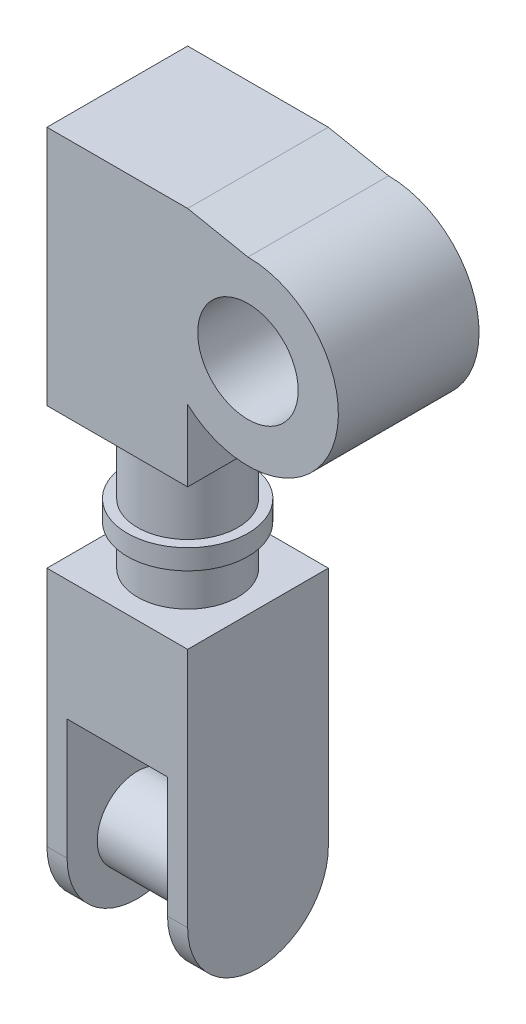
ISO-10303-21;
HEADER;
FILE_DESCRIPTION(('STEP AP214'),'2;1');
FILE_NAME('part.step','',(''),(''),'','','');
FILE_SCHEMA(('AUTOMOTIVE_DESIGN { 1 0 10303 214 1 1 1 1 }'));
ENDSEC;
DATA;
#1=APPLICATION_CONTEXT('core data for automotive mechanical design processes');
#2=APPLICATION_PROTOCOL_DEFINITION('international standard','automotive_design',2000,#1);
#3=PRODUCT_CONTEXT('',#1,'mechanical');
#4=PRODUCT('Part','Part','',(#3));
#5=PRODUCT_RELATED_PRODUCT_CATEGORY('part','',(#4));
#6=PRODUCT_DEFINITION_FORMATION('','',#4);
#7=PRODUCT_DEFINITION_CONTEXT('part definition',#1,'design');
#8=PRODUCT_DEFINITION('design','',#6,#7);
#9=PRODUCT_DEFINITION_SHAPE('','',#8);
#10=(LENGTH_UNIT() NAMED_UNIT(*) SI_UNIT(.MILLI.,.METRE.));
#11=(NAMED_UNIT(*) PLANE_ANGLE_UNIT() SI_UNIT($,.RADIAN.));
#12=(NAMED_UNIT(*) SI_UNIT($,.STERADIAN.) SOLID_ANGLE_UNIT());
#13=UNCERTAINTY_MEASURE_WITH_UNIT(LENGTH_MEASURE(1.E-05),#10,'distance_accuracy_value','');
#14=(GEOMETRIC_REPRESENTATION_CONTEXT(3) GLOBAL_UNCERTAINTY_ASSIGNED_CONTEXT((#13)) GLOBAL_UNIT_ASSIGNED_CONTEXT((#10,
#11,#12)) REPRESENTATION_CONTEXT('',''));
#15=CARTESIAN_POINT('',(0.,0.,0.));
#16=DIRECTION('',(0.,0.,1.));
#17=DIRECTION('',(1.,0.,0.));
#18=AXIS2_PLACEMENT_3D('',#15,#16,#17);
#19=CARTESIAN_POINT('',(35.,0.,35.));
#20=DIRECTION('',(0.,0.,-1.));
#21=DIRECTION('',(0.,1.,0.));
#22=AXIS2_PLACEMENT_3D('',#19,#20,#21);
#23=PLANE('',#22);
#24=DIRECTION('',(0.,-1.,0.));
#25=VECTOR('',#24,1.);
#26=CARTESIAN_POINT('',(-25.,0.,35.));
#27=LINE('',#26,#25);
#28=CARTESIAN_POINT('',(-25.,-130.,35.));
#29=VERTEX_POINT('',#28);
#30=CARTESIAN_POINT('',(-25.,-190.,35.));
#31=VERTEX_POINT('',#30);
#32=EDGE_CURVE('E155',#29,#31,#27,.T.);
#33=ORIENTED_EDGE('',*,*,#32,.F.);
#34=DIRECTION('',(1.,0.,0.));
#35=VECTOR('',#34,1.);
#36=CARTESIAN_POINT('',(-25.,-130.,35.));
#37=LINE('',#36,#35);
#38=CARTESIAN_POINT('',(25.,-130.,35.));
#39=VERTEX_POINT('',#38);
#40=EDGE_CURVE('E565',#29,#39,#37,.T.);
#41=ORIENTED_EDGE('',*,*,#40,.T.);
#42=DIRECTION('',(0.,-1.,0.));
#43=VECTOR('',#42,1.);
#44=CARTESIAN_POINT('',(25.,0.,35.));
#45=LINE('',#44,#43);
#46=CARTESIAN_POINT('',(25.,-190.,35.));
#47=VERTEX_POINT('',#46);
#48=EDGE_CURVE('E546',#39,#47,#45,.T.);
#49=ORIENTED_EDGE('',*,*,#48,.T.);
#50=DIRECTION('',(-1.,0.,0.));
#51=VECTOR('',#50,1.);
#52=CARTESIAN_POINT('',(35.,-190.,35.));
#53=LINE('',#52,#51);
#54=CARTESIAN_POINT('',(35.,-190.,35.));
#55=VERTEX_POINT('',#54);
#56=EDGE_CURVE('E182',#55,#47,#53,.T.);
#57=ORIENTED_EDGE('',*,*,#56,.F.);
#58=DIRECTION('',(0.,-1.,0.));
#59=VECTOR('',#58,1.);
#60=CARTESIAN_POINT('',(35.,0.,35.));
#61=LINE('',#60,#59);
#62=CARTESIAN_POINT('',(35.,-70.,35.));
#63=VERTEX_POINT('',#62);
#64=EDGE_CURVE('E570',#63,#55,#61,.T.);
#65=ORIENTED_EDGE('',*,*,#64,.F.);
#66=DIRECTION('',(-1.,0.,0.));
#67=VECTOR('',#66,1.);
#68=CARTESIAN_POINT('',(35.,-70.,35.));
#69=LINE('',#68,#67);
#70=CARTESIAN_POINT('',(-35.,-70.,35.));
#71=VERTEX_POINT('',#70);
#72=EDGE_CURVE('E585',#63,#71,#69,.T.);
#73=ORIENTED_EDGE('',*,*,#72,.T.);
#74=DIRECTION('',(0.,-1.,0.));
#75=VECTOR('',#74,1.);
#76=CARTESIAN_POINT('',(-35.,0.,35.));
#77=LINE('',#76,#75);
#78=CARTESIAN_POINT('',(-35.,-190.,35.));
#79=VERTEX_POINT('',#78);
#80=EDGE_CURVE('E180',#71,#79,#77,.T.);
#81=ORIENTED_EDGE('',*,*,#80,.T.);
#82=EDGE_CURVE('E172',#31,#79,#53,.T.);
#83=ORIENTED_EDGE('',*,*,#82,.F.);
#84=EDGE_LOOP('',(#33,#41,#49,#57,#65,#73,#81,#83));
#85=FACE_BOUND('',#84,.T.);
#86=ADVANCED_FACE('F41',(#85),#23,.F.);
#87=CARTESIAN_POINT('',(35.,-190.,0.));
#88=DIRECTION('',(-1.,0.,0.));
#89=DIRECTION('',(0.,0.,1.));
#90=AXIS2_PLACEMENT_3D('',#87,#88,#89);
#91=CYLINDRICAL_SURFACE('',#90,35.);
#92=CARTESIAN_POINT('',(-25.,-190.,0.));
#93=DIRECTION('',(1.,0.,0.));
#94=DIRECTION('',(0.,0.,-1.));
#95=AXIS2_PLACEMENT_3D('',#92,#93,#94);
#96=CIRCLE('',#95,35.);
#97=CARTESIAN_POINT('',(-25.,-190.,-35.));
#98=VERTEX_POINT('',#97);
#99=EDGE_CURVE('E159',#31,#98,#96,.T.);
#100=ORIENTED_EDGE('',*,*,#99,.F.);
#101=ORIENTED_EDGE('',*,*,#82,.T.);
#102=CARTESIAN_POINT('',(-35.,-190.,0.));
#103=DIRECTION('',(1.,0.,0.));
#104=DIRECTION('',(0.,0.,-1.));
#105=AXIS2_PLACEMENT_3D('',#102,#103,#104);
#106=CIRCLE('',#105,35.);
#107=CARTESIAN_POINT('',(-35.,-190.,-35.));
#108=VERTEX_POINT('',#107);
#109=EDGE_CURVE('E588',#79,#108,#106,.T.);
#110=ORIENTED_EDGE('',*,*,#109,.T.);
#111=DIRECTION('',(-1.,0.,0.));
#112=VECTOR('',#111,1.);
#113=CARTESIAN_POINT('',(35.,-190.,-35.));
#114=LINE('',#113,#112);
#115=EDGE_CURVE('E174',#98,#108,#114,.T.);
#116=ORIENTED_EDGE('',*,*,#115,.F.);
#117=EDGE_LOOP('',(#100,#101,#110,#116));
#118=FACE_BOUND('',#117,.T.);
#119=ADVANCED_FACE('F170',(#118),#91,.T.);
#120=CARTESIAN_POINT('',(35.,0.,-35.));
#121=DIRECTION('',(0.,0.,1.));
#122=DIRECTION('',(1.,0.,0.));
#123=AXIS2_PLACEMENT_3D('',#120,#121,#122);
#124=PLANE('',#123);
#125=DIRECTION('',(0.,-1.,0.));
#126=VECTOR('',#125,1.);
#127=CARTESIAN_POINT('',(-25.,0.,-35.));
#128=LINE('',#127,#126);
#129=CARTESIAN_POINT('',(-25.,-130.,-35.));
#130=VERTEX_POINT('',#129);
#131=EDGE_CURVE('E176',#130,#98,#128,.T.);
#132=ORIENTED_EDGE('',*,*,#131,.T.);
#133=ORIENTED_EDGE('',*,*,#115,.T.);
#134=DIRECTION('',(0.,1.,0.));
#135=VECTOR('',#134,1.);
#136=CARTESIAN_POINT('',(-35.,0.,-35.));
#137=LINE('',#136,#135);
#138=CARTESIAN_POINT('',(-35.,-70.,-35.));
#139=VERTEX_POINT('',#138);
#140=EDGE_CURVE('E591',#108,#139,#137,.T.);
#141=ORIENTED_EDGE('',*,*,#140,.T.);
#142=DIRECTION('',(-1.,0.,0.));
#143=VECTOR('',#142,1.);
#144=CARTESIAN_POINT('',(35.,-70.,-35.));
#145=LINE('',#144,#143);
#146=CARTESIAN_POINT('',(35.,-70.,-35.));
#147=VERTEX_POINT('',#146);
#148=EDGE_CURVE('E599',#147,#139,#145,.T.);
#149=ORIENTED_EDGE('',*,*,#148,.F.);
#150=DIRECTION('',(0.,1.,0.));
#151=VECTOR('',#150,1.);
#152=CARTESIAN_POINT('',(35.,0.,-35.));
#153=LINE('',#152,#151);
#154=CARTESIAN_POINT('',(35.,-190.,-35.));
#155=VERTEX_POINT('',#154);
#156=EDGE_CURVE('E578',#155,#147,#153,.T.);
#157=ORIENTED_EDGE('',*,*,#156,.F.);
#158=CARTESIAN_POINT('',(25.,-190.,-35.));
#159=VERTEX_POINT('',#158);
#160=EDGE_CURVE('E183',#155,#159,#114,.T.);
#161=ORIENTED_EDGE('',*,*,#160,.T.);
#162=DIRECTION('',(0.,-1.,0.));
#163=VECTOR('',#162,1.);
#164=CARTESIAN_POINT('',(25.,0.,-35.));
#165=LINE('',#164,#163);
#166=CARTESIAN_POINT('',(25.,-130.,-35.));
#167=VERTEX_POINT('',#166);
#168=EDGE_CURVE('E560',#167,#159,#165,.T.);
#169=ORIENTED_EDGE('',*,*,#168,.F.);
#170=DIRECTION('',(1.,0.,0.));
#171=VECTOR('',#170,1.);
#172=CARTESIAN_POINT('',(-25.,-130.,-35.));
#173=LINE('',#172,#171);
#174=EDGE_CURVE('E57',#130,#167,#173,.T.);
#175=ORIENTED_EDGE('',*,*,#174,.F.);
#176=EDGE_LOOP('',(#132,#133,#141,#149,#157,#161,#169,#175));
#177=FACE_BOUND('',#176,.T.);
#178=ADVANCED_FACE('F291',(#177),#124,.F.);
#179=CARTESIAN_POINT('',(35.,120.,35.));
#180=DIRECTION('',(-1.,0.,0.));
#181=DIRECTION('',(0.,0.,1.));
#182=AXIS2_PLACEMENT_3D('',#179,#180,#181);
#183=PLANE('',#182);
#184=DIRECTION('',(0.,-1.,0.));
#185=VECTOR('',#184,1.);
#186=CARTESIAN_POINT('',(35.,120.,-35.));
#187=LINE('',#186,#185);
#188=CARTESIAN_POINT('',(35.,35.5071731198865,-35.));
#189=VERTEX_POINT('',#188);
#190=CARTESIAN_POINT('',(35.,0.,-35.));
#191=VERTEX_POINT('',#190);
#192=EDGE_CURVE('E244',#189,#191,#187,.T.);
#193=ORIENTED_EDGE('',*,*,#192,.F.);
#194=DIRECTION('',(0.,0.,1.));
#195=VECTOR('',#194,1.);
#196=CARTESIAN_POINT('',(35.,35.5071731198865,-35.));
#197=LINE('',#196,#195);
#198=CARTESIAN_POINT('',(35.,35.5071731198865,35.));
#199=VERTEX_POINT('',#198);
#200=EDGE_CURVE('E212',#189,#199,#197,.T.);
#201=ORIENTED_EDGE('',*,*,#200,.T.);
#202=DIRECTION('',(0.,-1.,0.));
#203=VECTOR('',#202,1.);
#204=CARTESIAN_POINT('',(35.,120.,35.));
#205=LINE('',#204,#203);
#206=CARTESIAN_POINT('',(35.,0.,35.));
#207=VERTEX_POINT('',#206);
#208=EDGE_CURVE('E87',#199,#207,#205,.T.);
#209=ORIENTED_EDGE('',*,*,#208,.T.);
#210=DIRECTION('',(0.,0.,-1.));
#211=VECTOR('',#210,1.);
#212=CARTESIAN_POINT('',(35.,0.,35.));
#213=LINE('',#212,#211);
#214=EDGE_CURVE('E240',#207,#191,#213,.T.);
#215=ORIENTED_EDGE('',*,*,#214,.T.);
#216=EDGE_LOOP('',(#193,#201,#209,#215));
#217=FACE_BOUND('',#216,.T.);
#218=ADVANCED_FACE('F43',(#217),#183,.F.);
#219=CARTESIAN_POINT('',(-35.,120.,-35.));
#220=DIRECTION('',(0.,0.,1.));
#221=DIRECTION('',(1.,0.,0.));
#222=AXIS2_PLACEMENT_3D('',#219,#220,#221);
#223=PLANE('',#222);
#224=DIRECTION('',(-1.,0.,0.));
#225=VECTOR('',#224,1.);
#226=CARTESIAN_POINT('',(-35.,0.,-35.));
#227=LINE('',#226,#225);
#228=CARTESIAN_POINT('',(-35.,0.,-35.));
#229=VERTEX_POINT('',#228);
#230=EDGE_CURVE('E260',#191,#229,#227,.T.);
#231=ORIENTED_EDGE('',*,*,#230,.T.);
#232=DIRECTION('',(0.,-1.,0.));
#233=VECTOR('',#232,1.);
#234=CARTESIAN_POINT('',(-35.,120.,-35.));
#235=LINE('',#234,#233);
#236=CARTESIAN_POINT('',(-35.,120.,-35.));
#237=VERTEX_POINT('',#236);
#238=EDGE_CURVE('E274',#237,#229,#235,.T.);
#239=ORIENTED_EDGE('',*,*,#238,.F.);
#240=DIRECTION('',(-1.,0.,0.));
#241=VECTOR('',#240,1.);
#242=CARTESIAN_POINT('',(-35.,120.,-35.));
#243=LINE('',#242,#241);
#244=CARTESIAN_POINT('',(35.,120.,-35.));
#245=VERTEX_POINT('',#244);
#246=EDGE_CURVE('E249',#245,#237,#243,.T.);
#247=ORIENTED_EDGE('',*,*,#246,.F.);
#248=DIRECTION('',(0.980882527347109,-0.194600790196619,0.));
#249=VECTOR('',#248,1.);
#250=CARTESIAN_POINT('',(24.2310931534967,122.136481916495,-35.));
#251=LINE('',#250,#249);
#252=CARTESIAN_POINT('',(65.,114.048192782383,-35.));
#253=VERTEX_POINT('',#252);
#254=EDGE_CURVE('E94',#245,#253,#251,.T.);
#255=ORIENTED_EDGE('',*,*,#254,.T.);
#256=CARTESIAN_POINT('',(65.,69.0481927823834,-35.));
#257=DIRECTION('',(0.,0.,1.));
#258=DIRECTION('',(1.,0.,0.));
#259=AXIS2_PLACEMENT_3D('',#256,#257,#258);
#260=CIRCLE('',#259,45.);
#261=EDGE_CURVE('E205',#189,#253,#260,.T.);
#262=ORIENTED_EDGE('',*,*,#261,.F.);
#263=ORIENTED_EDGE('',*,*,#192,.T.);
#264=EDGE_LOOP('',(#231,#239,#247,#255,#262,#263));
#265=FACE_BOUND('',#264,.T.);
#266=CARTESIAN_POINT('',(65.,69.0481927823834,-35.));
#267=DIRECTION('',(0.,0.,1.));
#268=DIRECTION('',(1.,0.,0.));
#269=AXIS2_PLACEMENT_3D('',#266,#267,#268);
#270=CIRCLE('',#269,25.);
#271=CARTESIAN_POINT('',(90.,69.0481927823834,-35.));
#272=VERTEX_POINT('',#271);
#273=EDGE_CURVE('E201',#272,#272,#270,.T.);
#274=ORIENTED_EDGE('',*,*,#273,.T.);
#275=EDGE_LOOP('',(#274));
#276=FACE_BOUND('',#275,.T.);
#277=ADVANCED_FACE('F282',(#265,#276),#223,.F.);
#278=CARTESIAN_POINT('',(-35.,120.,35.));
#279=DIRECTION('',(1.,0.,0.));
#280=DIRECTION('',(0.,0.,-1.));
#281=AXIS2_PLACEMENT_3D('',#278,#279,#280);
#282=PLANE('',#281);
#283=DIRECTION('',(0.,0.,1.));
#284=VECTOR('',#283,1.);
#285=CARTESIAN_POINT('',(-35.,0.,35.));
#286=LINE('',#285,#284);
#287=CARTESIAN_POINT('',(-35.,0.,35.));
#288=VERTEX_POINT('',#287);
#289=EDGE_CURVE('E263',#229,#288,#286,.T.);
#290=ORIENTED_EDGE('',*,*,#289,.T.);
#291=DIRECTION('',(0.,-1.,0.));
#292=VECTOR('',#291,1.);
#293=CARTESIAN_POINT('',(-35.,120.,35.));
#294=LINE('',#293,#292);
#295=CARTESIAN_POINT('',(-35.,120.,35.));
#296=VERTEX_POINT('',#295);
#297=EDGE_CURVE('E270',#296,#288,#294,.T.);
#298=ORIENTED_EDGE('',*,*,#297,.F.);
#299=DIRECTION('',(0.,0.,1.));
#300=VECTOR('',#299,1.);
#301=CARTESIAN_POINT('',(-35.,120.,35.));
#302=LINE('',#301,#300);
#303=EDGE_CURVE('E66',#237,#296,#302,.T.);
#304=ORIENTED_EDGE('',*,*,#303,.F.);
#305=ORIENTED_EDGE('',*,*,#238,.T.);
#306=EDGE_LOOP('',(#290,#298,#304,#305));
#307=FACE_BOUND('',#306,.T.);
#308=ADVANCED_FACE('F296',(#307),#282,.F.);
#309=CARTESIAN_POINT('',(-35.,120.,35.));
#310=DIRECTION('',(0.,0.,-1.));
#311=DIRECTION('',(-1.,0.,0.));
#312=AXIS2_PLACEMENT_3D('',#309,#310,#311);
#313=PLANE('',#312);
#314=DIRECTION('',(1.,0.,0.));
#315=VECTOR('',#314,1.);
#316=CARTESIAN_POINT('',(-35.,0.,35.));
#317=LINE('',#316,#315);
#318=EDGE_CURVE('E250',#288,#207,#317,.T.);
#319=ORIENTED_EDGE('',*,*,#318,.T.);
#320=ORIENTED_EDGE('',*,*,#208,.F.);
#321=CARTESIAN_POINT('',(65.,69.0481927823834,35.));
#322=DIRECTION('',(0.,0.,1.));
#323=DIRECTION('',(1.,0.,0.));
#324=AXIS2_PLACEMENT_3D('',#321,#322,#323);
#325=CIRCLE('',#324,45.);
#326=CARTESIAN_POINT('',(65.,114.048192782383,35.));
#327=VERTEX_POINT('',#326);
#328=EDGE_CURVE('E216',#199,#327,#325,.T.);
#329=ORIENTED_EDGE('',*,*,#328,.T.);
#330=DIRECTION('',(0.980882527347109,-0.194600790196619,0.));
#331=VECTOR('',#330,1.);
#332=CARTESIAN_POINT('',(24.2310931534967,122.136481916495,35.));
#333=LINE('',#332,#331);
#334=CARTESIAN_POINT('',(35.,120.,35.));
#335=VERTEX_POINT('',#334);
#336=EDGE_CURVE('E206',#335,#327,#333,.T.);
#337=ORIENTED_EDGE('',*,*,#336,.F.);
#338=DIRECTION('',(1.,0.,0.));
#339=VECTOR('',#338,1.);
#340=CARTESIAN_POINT('',(-35.,120.,35.));
#341=LINE('',#340,#339);
#342=EDGE_CURVE('E255',#296,#335,#341,.T.);
#343=ORIENTED_EDGE('',*,*,#342,.F.);
#344=ORIENTED_EDGE('',*,*,#297,.T.);
#345=EDGE_LOOP('',(#319,#320,#329,#337,#343,#344));
#346=FACE_BOUND('',#345,.T.);
#347=CARTESIAN_POINT('',(65.,69.0481927823834,35.));
#348=DIRECTION('',(0.,0.,1.));
#349=DIRECTION('',(1.,0.,0.));
#350=AXIS2_PLACEMENT_3D('',#347,#348,#349);
#351=CIRCLE('',#350,25.);
#352=CARTESIAN_POINT('',(90.,69.0481927823834,35.));
#353=VERTEX_POINT('',#352);
#354=EDGE_CURVE('E196',#353,#353,#351,.T.);
#355=ORIENTED_EDGE('',*,*,#354,.F.);
#356=EDGE_LOOP('',(#355));
#357=FACE_BOUND('',#356,.T.);
#358=ADVANCED_FACE('F341',(#346,#357),#313,.F.);
#359=CARTESIAN_POINT('',(0.,120.,0.));
#360=DIRECTION('',(0.,-1.,0.));
#361=DIRECTION('',(0.,0.,-1.));
#362=AXIS2_PLACEMENT_3D('',#359,#360,#361);
#363=PLANE('',#362);
#364=DIRECTION('',(0.,0.,-1.));
#365=VECTOR('',#364,1.);
#366=CARTESIAN_POINT('',(35.,120.,35.));
#367=LINE('',#366,#365);
#368=EDGE_CURVE('E245',#335,#245,#367,.T.);
#369=ORIENTED_EDGE('',*,*,#368,.T.);
#370=ORIENTED_EDGE('',*,*,#246,.T.);
#371=ORIENTED_EDGE('',*,*,#303,.T.);
#372=ORIENTED_EDGE('',*,*,#342,.T.);
#373=EDGE_LOOP('',(#369,#370,#371,#372));
#374=FACE_BOUND('',#373,.T.);
#375=ADVANCED_FACE('F338',(#374),#363,.F.);
#376=CARTESIAN_POINT('',(0.,0.,0.));
#377=DIRECTION('',(0.,-1.,0.));
#378=DIRECTION('',(0.,0.,-1.));
#379=AXIS2_PLACEMENT_3D('',#376,#377,#378);
#380=PLANE('',#379);
#381=CARTESIAN_POINT('',(0.,0.,0.));
#382=DIRECTION('',(0.,-1.,0.));
#383=DIRECTION('',(0.,0.,-1.));
#384=AXIS2_PLACEMENT_3D('',#381,#382,#383);
#385=CIRCLE('',#384,25.);
#386=CARTESIAN_POINT('',(0.,0.,-25.));
#387=VERTEX_POINT('',#386);
#388=EDGE_CURVE('E200',#387,#387,#385,.T.);
#389=ORIENTED_EDGE('',*,*,#388,.F.);
#390=EDGE_LOOP('',(#389));
#391=FACE_BOUND('',#390,.T.);
#392=ORIENTED_EDGE('',*,*,#214,.F.);
#393=ORIENTED_EDGE('',*,*,#318,.F.);
#394=ORIENTED_EDGE('',*,*,#289,.F.);
#395=ORIENTED_EDGE('',*,*,#230,.F.);
#396=EDGE_LOOP('',(#392,#393,#394,#395));
#397=FACE_BOUND('',#396,.T.);
#398=ADVANCED_FACE('F288',(#391,#397),#380,.T.);
#399=CARTESIAN_POINT('',(0.,-40.,0.));
#400=DIRECTION('',(0.,1.,0.));
#401=DIRECTION('',(0.,0.,1.));
#402=AXIS2_PLACEMENT_3D('',#399,#400,#401);
#403=CYLINDRICAL_SURFACE('',#402,25.);
#404=CARTESIAN_POINT('',(0.,-40.,0.));
#405=DIRECTION('',(0.,-1.,0.));
#406=DIRECTION('',(0.,0.,-1.));
#407=AXIS2_PLACEMENT_3D('',#404,#405,#406);
#408=CIRCLE('',#407,25.);
#409=CARTESIAN_POINT('',(0.,-40.,-25.));
#410=VERTEX_POINT('',#409);
#411=EDGE_CURVE('E233',#410,#410,#408,.T.);
#412=ORIENTED_EDGE('',*,*,#411,.F.);
#413=EDGE_LOOP('',(#412));
#414=FACE_BOUND('',#413,.T.);
#415=ORIENTED_EDGE('',*,*,#388,.T.);
#416=EDGE_LOOP('',(#415));
#417=FACE_BOUND('',#416,.T.);
#418=ADVANCED_FACE('F333',(#414,#417),#403,.T.);
#419=CARTESIAN_POINT('',(0.,-50.,0.));
#420=DIRECTION('',(0.,1.,0.));
#421=DIRECTION('',(0.,0.,1.));
#422=AXIS2_PLACEMENT_3D('',#419,#420,#421);
#423=CYLINDRICAL_SURFACE('',#422,30.);
#424=CARTESIAN_POINT('',(0.,-50.,0.));
#425=DIRECTION('',(0.,-1.,0.));
#426=DIRECTION('',(0.,0.,-1.));
#427=AXIS2_PLACEMENT_3D('',#424,#425,#426);
#428=CIRCLE('',#427,30.);
#429=CARTESIAN_POINT('',(0.,-50.,-30.));
#430=VERTEX_POINT('',#429);
#431=EDGE_CURVE('E229',#430,#430,#428,.T.);
#432=ORIENTED_EDGE('',*,*,#431,.F.);
#433=EDGE_LOOP('',(#432));
#434=FACE_BOUND('',#433,.T.);
#435=CARTESIAN_POINT('',(0.,-40.,0.));
#436=DIRECTION('',(0.,-1.,0.));
#437=DIRECTION('',(0.,0.,-1.));
#438=AXIS2_PLACEMENT_3D('',#435,#436,#437);
#439=CIRCLE('',#438,30.);
#440=CARTESIAN_POINT('',(0.,-40.,-30.));
#441=VERTEX_POINT('',#440);
#442=EDGE_CURVE('E226',#441,#441,#439,.T.);
#443=ORIENTED_EDGE('',*,*,#442,.T.);
#444=EDGE_LOOP('',(#443));
#445=FACE_BOUND('',#444,.T.);
#446=ADVANCED_FACE('F326',(#434,#445),#423,.T.);
#447=CARTESIAN_POINT('',(0.,-50.,0.));
#448=DIRECTION('',(0.,-1.,0.));
#449=DIRECTION('',(0.,0.,-1.));
#450=AXIS2_PLACEMENT_3D('',#447,#448,#449);
#451=PLANE('',#450);
#452=CARTESIAN_POINT('',(0.,-50.,0.));
#453=DIRECTION('',(0.,-1.,0.));
#454=DIRECTION('',(0.,0.,-1.));
#455=AXIS2_PLACEMENT_3D('',#452,#453,#454);
#456=CIRCLE('',#455,25.);
#457=CARTESIAN_POINT('',(0.,-50.,-25.));
#458=VERTEX_POINT('',#457);
#459=EDGE_CURVE('E50',#458,#458,#456,.T.);
#460=ORIENTED_EDGE('',*,*,#459,.F.);
#461=EDGE_LOOP('',(#460));
#462=FACE_BOUND('',#461,.T.);
#463=ORIENTED_EDGE('',*,*,#431,.T.);
#464=EDGE_LOOP('',(#463));
#465=FACE_BOUND('',#464,.T.);
#466=ADVANCED_FACE('F323',(#462,#465),#451,.T.);
#467=CARTESIAN_POINT('',(0.,-40.,0.));
#468=DIRECTION('',(0.,-1.,0.));
#469=DIRECTION('',(0.,0.,-1.));
#470=AXIS2_PLACEMENT_3D('',#467,#468,#469);
#471=PLANE('',#470);
#472=ORIENTED_EDGE('',*,*,#411,.T.);
#473=EDGE_LOOP('',(#472));
#474=FACE_BOUND('',#473,.T.);
#475=ORIENTED_EDGE('',*,*,#442,.F.);
#476=EDGE_LOOP('',(#475));
#477=FACE_BOUND('',#476,.T.);
#478=ADVANCED_FACE('F316',(#474,#477),#471,.F.);
#479=CARTESIAN_POINT('',(24.2310931534967,122.136481916495,-35.));
#480=DIRECTION('',(-0.194600790196619,-0.980882527347109,0.));
#481=DIRECTION('',(0.980882527347109,-0.194600790196619,0.));
#482=AXIS2_PLACEMENT_3D('',#479,#480,#481);
#483=PLANE('',#482);
#484=ORIENTED_EDGE('',*,*,#336,.T.);
#485=DIRECTION('',(0.,0.,1.));
#486=VECTOR('',#485,1.);
#487=CARTESIAN_POINT('',(65.,114.048192782383,-35.));
#488=LINE('',#487,#486);
#489=EDGE_CURVE('E223',#253,#327,#488,.T.);
#490=ORIENTED_EDGE('',*,*,#489,.F.);
#491=ORIENTED_EDGE('',*,*,#254,.F.);
#492=ORIENTED_EDGE('',*,*,#368,.F.);
#493=EDGE_LOOP('',(#484,#490,#491,#492));
#494=FACE_BOUND('',#493,.T.);
#495=ADVANCED_FACE('F312',(#494),#483,.F.);
#496=CARTESIAN_POINT('',(65.,69.0481927823834,-35.));
#497=DIRECTION('',(0.,0.,1.));
#498=DIRECTION('',(1.,0.,0.));
#499=AXIS2_PLACEMENT_3D('',#496,#497,#498);
#500=CYLINDRICAL_SURFACE('',#499,25.);
#501=ORIENTED_EDGE('',*,*,#273,.F.);
#502=EDGE_LOOP('',(#501));
#503=FACE_BOUND('',#502,.T.);
#504=ORIENTED_EDGE('',*,*,#354,.T.);
#505=EDGE_LOOP('',(#504));
#506=FACE_BOUND('',#505,.T.);
#507=ADVANCED_FACE('F315',(#503,#506),#500,.F.);
#508=CARTESIAN_POINT('',(65.,69.0481927823834,-35.));
#509=DIRECTION('',(0.,0.,1.));
#510=DIRECTION('',(1.,0.,0.));
#511=AXIS2_PLACEMENT_3D('',#508,#509,#510);
#512=CYLINDRICAL_SURFACE('',#511,45.);
#513=ORIENTED_EDGE('',*,*,#328,.F.);
#514=ORIENTED_EDGE('',*,*,#200,.F.);
#515=ORIENTED_EDGE('',*,*,#261,.T.);
#516=ORIENTED_EDGE('',*,*,#489,.T.);
#517=EDGE_LOOP('',(#513,#514,#515,#516));
#518=FACE_BOUND('',#517,.T.);
#519=ADVANCED_FACE('F310',(#518),#512,.T.);
#520=CARTESIAN_POINT('',(0.,-70.,0.));
#521=DIRECTION('',(0.,1.,0.));
#522=DIRECTION('',(0.,0.,1.));
#523=AXIS2_PLACEMENT_3D('',#520,#521,#522);
#524=CYLINDRICAL_SURFACE('',#523,25.);
#525=CARTESIAN_POINT('',(0.,-70.,0.));
#526=DIRECTION('',(0.,-1.,0.));
#527=DIRECTION('',(0.,0.,-1.));
#528=AXIS2_PLACEMENT_3D('',#525,#526,#527);
#529=CIRCLE('',#528,25.);
#530=CARTESIAN_POINT('',(0.,-70.,-25.));
#531=VERTEX_POINT('',#530);
#532=EDGE_CURVE('E188',#531,#531,#529,.T.);
#533=ORIENTED_EDGE('',*,*,#532,.F.);
#534=EDGE_LOOP('',(#533));
#535=FACE_BOUND('',#534,.T.);
#536=ORIENTED_EDGE('',*,*,#459,.T.);
#537=EDGE_LOOP('',(#536));
#538=FACE_BOUND('',#537,.T.);
#539=ADVANCED_FACE('F307',(#535,#538),#524,.T.);
#540=ORIENTED_EDGE('',*,*,#56,.T.);
#541=CARTESIAN_POINT('',(25.,-190.,0.));
#542=DIRECTION('',(1.,0.,0.));
#543=DIRECTION('',(0.,0.,-1.));
#544=AXIS2_PLACEMENT_3D('',#541,#542,#543);
#545=CIRCLE('',#544,35.);
#546=EDGE_CURVE('E550',#47,#159,#545,.T.);
#547=ORIENTED_EDGE('',*,*,#546,.T.);
#548=ORIENTED_EDGE('',*,*,#160,.F.);
#549=CARTESIAN_POINT('',(35.,-190.,0.));
#550=DIRECTION('',(1.,0.,0.));
#551=DIRECTION('',(0.,0.,-1.));
#552=AXIS2_PLACEMENT_3D('',#549,#550,#551);
#553=CIRCLE('',#552,35.);
#554=EDGE_CURVE('E574',#55,#155,#553,.T.);
#555=ORIENTED_EDGE('',*,*,#554,.F.);
#556=EDGE_LOOP('',(#540,#547,#548,#555));
#557=FACE_BOUND('',#556,.T.);
#558=ADVANCED_FACE('F305',(#557),#91,.T.);
#559=CARTESIAN_POINT('',(35.,-70.,0.));
#560=DIRECTION('',(0.,1.,0.));
#561=DIRECTION('',(0.,0.,1.));
#562=AXIS2_PLACEMENT_3D('',#559,#560,#561);
#563=PLANE('',#562);
#564=ORIENTED_EDGE('',*,*,#532,.T.);
#565=EDGE_LOOP('',(#564));
#566=FACE_BOUND('',#565,.T.);
#567=DIRECTION('',(0.,0.,-1.));
#568=VECTOR('',#567,1.);
#569=CARTESIAN_POINT('',(-35.,-70.,0.));
#570=LINE('',#569,#568);
#571=EDGE_CURVE('E575',#71,#139,#570,.T.);
#572=ORIENTED_EDGE('',*,*,#571,.F.);
#573=ORIENTED_EDGE('',*,*,#72,.F.);
#574=DIRECTION('',(0.,0.,-1.));
#575=VECTOR('',#574,1.);
#576=CARTESIAN_POINT('',(35.,-70.,0.));
#577=LINE('',#576,#575);
#578=EDGE_CURVE('E581',#63,#147,#577,.T.);
#579=ORIENTED_EDGE('',*,*,#578,.T.);
#580=ORIENTED_EDGE('',*,*,#148,.T.);
#581=EDGE_LOOP('',(#572,#573,#579,#580));
#582=FACE_BOUND('',#581,.T.);
#583=ADVANCED_FACE('F409',(#566,#582),#563,.T.);
#584=CARTESIAN_POINT('',(35.,0.,0.));
#585=DIRECTION('',(1.,0.,0.));
#586=DIRECTION('',(0.,0.,-1.));
#587=AXIS2_PLACEMENT_3D('',#584,#585,#586);
#588=PLANE('',#587);
#589=ORIENTED_EDGE('',*,*,#64,.T.);
#590=ORIENTED_EDGE('',*,*,#554,.T.);
#591=ORIENTED_EDGE('',*,*,#156,.T.);
#592=ORIENTED_EDGE('',*,*,#578,.F.);
#593=EDGE_LOOP('',(#589,#590,#591,#592));
#594=FACE_BOUND('',#593,.T.);
#595=ADVANCED_FACE('F417',(#594),#588,.T.);
#596=CARTESIAN_POINT('',(-35.,0.,0.));
#597=DIRECTION('',(1.,0.,0.));
#598=DIRECTION('',(0.,0.,-1.));
#599=AXIS2_PLACEMENT_3D('',#596,#597,#598);
#600=PLANE('',#599);
#601=ORIENTED_EDGE('',*,*,#80,.F.);
#602=ORIENTED_EDGE('',*,*,#571,.T.);
#603=ORIENTED_EDGE('',*,*,#140,.F.);
#604=ORIENTED_EDGE('',*,*,#109,.F.);
#605=EDGE_LOOP('',(#601,#602,#603,#604));
#606=FACE_BOUND('',#605,.T.);
#607=ADVANCED_FACE('F425',(#606),#600,.F.);
#608=CARTESIAN_POINT('',(-25.,-130.,0.));
#609=DIRECTION('',(0.,-1.,0.));
#610=DIRECTION('',(0.,0.,-1.));
#611=AXIS2_PLACEMENT_3D('',#608,#609,#610);
#612=PLANE('',#611);
#613=DIRECTION('',(0.,0.,-1.));
#614=VECTOR('',#613,1.);
#615=CARTESIAN_POINT('',(25.,-130.,0.));
#616=LINE('',#615,#614);
#617=EDGE_CURVE('E166',#39,#167,#616,.T.);
#618=ORIENTED_EDGE('',*,*,#617,.F.);
#619=ORIENTED_EDGE('',*,*,#40,.F.);
#620=DIRECTION('',(0.,0.,-1.));
#621=VECTOR('',#620,1.);
#622=CARTESIAN_POINT('',(-25.,-130.,0.));
#623=LINE('',#622,#621);
#624=EDGE_CURVE('E161',#29,#130,#623,.T.);
#625=ORIENTED_EDGE('',*,*,#624,.T.);
#626=ORIENTED_EDGE('',*,*,#174,.T.);
#627=EDGE_LOOP('',(#618,#619,#625,#626));
#628=FACE_BOUND('',#627,.T.);
#629=ADVANCED_FACE('F433',(#628),#612,.T.);
#630=CARTESIAN_POINT('',(-25.,0.,0.));
#631=DIRECTION('',(1.,0.,0.));
#632=DIRECTION('',(0.,0.,-1.));
#633=AXIS2_PLACEMENT_3D('',#630,#631,#632);
#634=PLANE('',#633);
#635=CARTESIAN_POINT('',(-25.,-190.,0.));
#636=DIRECTION('',(1.,0.,0.));
#637=DIRECTION('',(0.,0.,-1.));
#638=AXIS2_PLACEMENT_3D('',#635,#636,#637);
#639=CIRCLE('',#638,20.);
#640=CARTESIAN_POINT('',(-25.,-190.,-20.));
#641=VERTEX_POINT('',#640);
#642=EDGE_CURVE('E544',#641,#641,#639,.T.);
#643=ORIENTED_EDGE('',*,*,#642,.F.);
#644=EDGE_LOOP('',(#643));
#645=FACE_BOUND('',#644,.T.);
#646=ORIENTED_EDGE('',*,*,#32,.T.);
#647=ORIENTED_EDGE('',*,*,#99,.T.);
#648=ORIENTED_EDGE('',*,*,#131,.F.);
#649=ORIENTED_EDGE('',*,*,#624,.F.);
#650=EDGE_LOOP('',(#646,#647,#648,#649));
#651=FACE_BOUND('',#650,.T.);
#652=ADVANCED_FACE('F157',(#645,#651),#634,.T.);
#653=CARTESIAN_POINT('',(25.,0.,0.));
#654=DIRECTION('',(1.,0.,0.));
#655=DIRECTION('',(0.,0.,-1.));
#656=AXIS2_PLACEMENT_3D('',#653,#654,#655);
#657=PLANE('',#656);
#658=CARTESIAN_POINT('',(25.,-190.,0.));
#659=DIRECTION('',(1.,0.,0.));
#660=DIRECTION('',(0.,0.,-1.));
#661=AXIS2_PLACEMENT_3D('',#658,#659,#660);
#662=CIRCLE('',#661,20.);
#663=CARTESIAN_POINT('',(25.,-190.,-20.));
#664=VERTEX_POINT('',#663);
#665=EDGE_CURVE('E11',#664,#664,#662,.F.);
#666=ORIENTED_EDGE('',*,*,#665,.F.);
#667=EDGE_LOOP('',(#666));
#668=FACE_BOUND('',#667,.T.);
#669=ORIENTED_EDGE('',*,*,#48,.F.);
#670=ORIENTED_EDGE('',*,*,#617,.T.);
#671=ORIENTED_EDGE('',*,*,#168,.T.);
#672=ORIENTED_EDGE('',*,*,#546,.F.);
#673=EDGE_LOOP('',(#669,#670,#671,#672));
#674=FACE_BOUND('',#673,.T.);
#675=ADVANCED_FACE('F446',(#668,#674),#657,.F.);
#676=CARTESIAN_POINT('',(25.,-190.,0.));
#677=DIRECTION('',(-1.,0.,0.));
#678=DIRECTION('',(0.,0.,1.));
#679=AXIS2_PLACEMENT_3D('',#676,#677,#678);
#680=CYLINDRICAL_SURFACE('',#679,20.);
#681=ORIENTED_EDGE('',*,*,#665,.T.);
#682=EDGE_LOOP('',(#681));
#683=FACE_BOUND('',#682,.T.);
#684=ORIENTED_EDGE('',*,*,#642,.T.);
#685=EDGE_LOOP('',(#684));
#686=FACE_BOUND('',#685,.T.);
#687=ADVANCED_FACE('F454',(#683,#686),#680,.T.);
#688=CLOSED_SHELL('',(#86,#119,#178,#218,#277,#308,#358,#375,#398,#418,#446,#466,#478,#495,#507,
#519,#539,#558,#583,#595,#607,#629,#652,#675,#687));
#689=MANIFOLD_SOLID_BREP('B2',#688);
#690=ADVANCED_BREP_SHAPE_REPRESENTATION('',(#18,#689),#14);
#691=SHAPE_DEFINITION_REPRESENTATION(#9,#690);
ENDSEC;
END-ISO-10303-21;
